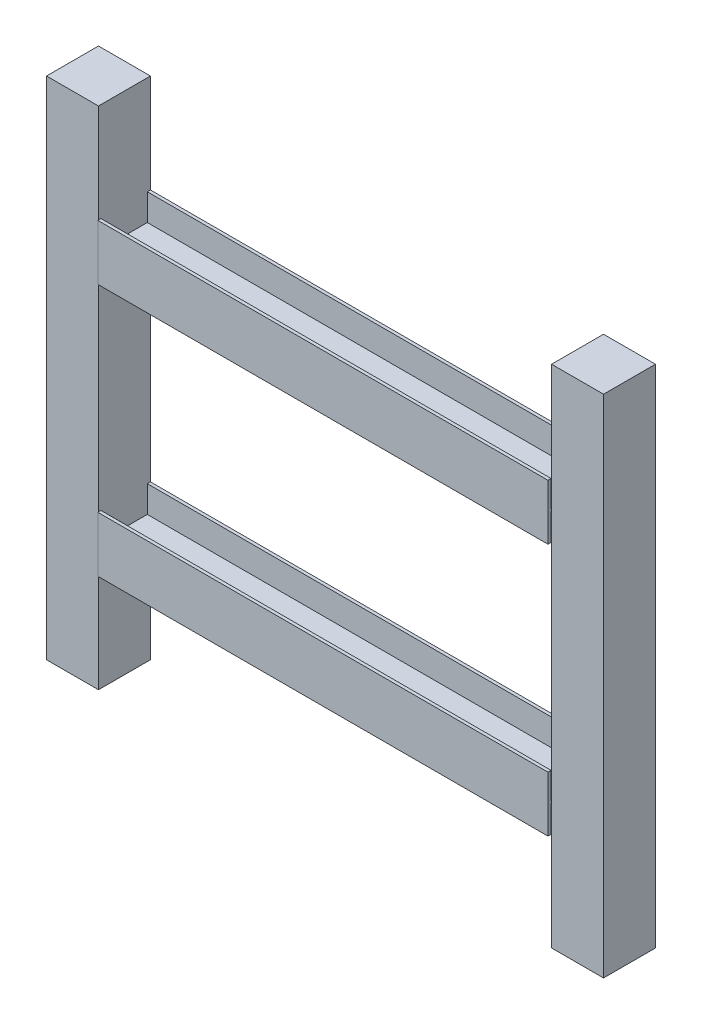
ISO-10303-21;
HEADER;
FILE_DESCRIPTION(('STEP AP214'),'2;1');
FILE_NAME('part.step','',(''),(''),'','','');
FILE_SCHEMA(('AUTOMOTIVE_DESIGN { 1 0 10303 214 1 1 1 1 }'));
ENDSEC;
DATA;
#1=APPLICATION_CONTEXT('core data for automotive mechanical design processes');
#2=APPLICATION_PROTOCOL_DEFINITION('international standard','automotive_design',2000,#1);
#3=PRODUCT_CONTEXT('',#1,'mechanical');
#4=PRODUCT('Part','Part','',(#3));
#5=PRODUCT_RELATED_PRODUCT_CATEGORY('part','',(#4));
#6=PRODUCT_DEFINITION_FORMATION('','',#4);
#7=PRODUCT_DEFINITION_CONTEXT('part definition',#1,'design');
#8=PRODUCT_DEFINITION('design','',#6,#7);
#9=PRODUCT_DEFINITION_SHAPE('','',#8);
#10=(LENGTH_UNIT() NAMED_UNIT(*) SI_UNIT(.MILLI.,.METRE.));
#11=(NAMED_UNIT(*) PLANE_ANGLE_UNIT() SI_UNIT($,.RADIAN.));
#12=(NAMED_UNIT(*) SI_UNIT($,.STERADIAN.) SOLID_ANGLE_UNIT());
#13=UNCERTAINTY_MEASURE_WITH_UNIT(LENGTH_MEASURE(1.E-05),#10,'distance_accuracy_value','');
#14=(GEOMETRIC_REPRESENTATION_CONTEXT(3) GLOBAL_UNCERTAINTY_ASSIGNED_CONTEXT((#13)) GLOBAL_UNIT_ASSIGNED_CONTEXT((#10,
#11,#12)) REPRESENTATION_CONTEXT('',''));
#15=CARTESIAN_POINT('',(0.,0.,0.));
#16=DIRECTION('',(0.,0.,1.));
#17=DIRECTION('',(1.,0.,0.));
#18=AXIS2_PLACEMENT_3D('',#15,#16,#17);
#19=CARTESIAN_POINT('',(1409.46226886423,1175.000000025,-104.565781535211));
#20=DIRECTION('',(0.,0.,-1.));
#21=DIRECTION('',(-1.,0.,0.));
#22=AXIS2_PLACEMENT_3D('',#19,#20,#21);
#23=PLANE('',#22);
#24=DIRECTION('',(0.,-1.,0.));
#25=VECTOR('',#24,1.);
#26=CARTESIAN_POINT('',(109.462268864228,1175.000000025,-104.565781535211));
#27=LINE('',#26,#25);
#28=CARTESIAN_POINT('',(109.462268864228,1175.000000025,-104.565781535211));
#29=VERTEX_POINT('',#28);
#30=CARTESIAN_POINT('',(109.462268864228,1097.99999993,-104.565781535211));
#31=VERTEX_POINT('',#30);
#32=EDGE_CURVE('E164',#29,#31,#27,.T.);
#33=ORIENTED_EDGE('',*,*,#32,.T.);
#34=DIRECTION('',(-1.,0.,0.));
#35=VECTOR('',#34,1.);
#36=CARTESIAN_POINT('',(1409.46226886423,1097.99999993,-104.565781535211));
#37=LINE('',#36,#35);
#38=CARTESIAN_POINT('',(1409.46226886423,1097.99999993,-104.565781535211));
#39=VERTEX_POINT('',#38);
#40=EDGE_CURVE('E12',#39,#31,#37,.T.);
#41=ORIENTED_EDGE('',*,*,#40,.F.);
#42=DIRECTION('',(0.,-1.,0.));
#43=VECTOR('',#42,1.);
#44=CARTESIAN_POINT('',(1409.46226886423,1175.000000025,-104.565781535211));
#45=LINE('',#44,#43);
#46=CARTESIAN_POINT('',(1409.46226886423,1175.000000025,-104.565781535211));
#47=VERTEX_POINT('',#46);
#48=EDGE_CURVE('E186',#47,#39,#45,.T.);
#49=ORIENTED_EDGE('',*,*,#48,.F.);
#50=DIRECTION('',(-1.,0.,0.));
#51=VECTOR('',#50,1.);
#52=CARTESIAN_POINT('',(1409.46226886423,1175.000000025,-104.565781535211));
#53=LINE('',#52,#51);
#54=EDGE_CURVE('E160',#47,#29,#53,.T.);
#55=ORIENTED_EDGE('',*,*,#54,.T.);
#56=EDGE_LOOP('',(#33,#41,#49,#55));
#57=FACE_BOUND('',#56,.T.);
#58=ADVANCED_FACE('F44',(#57),#23,.F.);
#59=CARTESIAN_POINT('',(1409.46226886423,1097.99999993,29.4342184697886));
#60=DIRECTION('',(0.,-1.,0.));
#61=DIRECTION('',(0.,0.,-1.));
#62=AXIS2_PLACEMENT_3D('',#59,#60,#61);
#63=PLANE('',#62);
#64=DIRECTION('',(0.,0.,1.));
#65=VECTOR('',#64,1.);
#66=CARTESIAN_POINT('',(109.462268864228,1097.99999993,29.4342184697886));
#67=LINE('',#66,#65);
#68=CARTESIAN_POINT('',(109.462268864228,1097.99999993,29.4342184697886));
#69=VERTEX_POINT('',#68);
#70=EDGE_CURVE('E167',#31,#69,#67,.T.);
#71=ORIENTED_EDGE('',*,*,#70,.T.);
#72=DIRECTION('',(-1.,0.,0.));
#73=VECTOR('',#72,1.);
#74=CARTESIAN_POINT('',(1409.46226886423,1097.99999993,29.4342184697886));
#75=LINE('',#74,#73);
#76=CARTESIAN_POINT('',(1409.46226886423,1097.99999993,29.4342184697886));
#77=VERTEX_POINT('',#76);
#78=EDGE_CURVE('E52',#77,#69,#75,.T.);
#79=ORIENTED_EDGE('',*,*,#78,.F.);
#80=DIRECTION('',(0.,0.,1.));
#81=VECTOR('',#80,1.);
#82=CARTESIAN_POINT('',(1409.46226886423,1097.99999993,29.4342184697886));
#83=LINE('',#82,#81);
#84=EDGE_CURVE('E115',#39,#77,#83,.T.);
#85=ORIENTED_EDGE('',*,*,#84,.F.);
#86=ORIENTED_EDGE('',*,*,#40,.T.);
#87=EDGE_LOOP('',(#71,#79,#85,#86));
#88=FACE_BOUND('',#87,.T.);
#89=ADVANCED_FACE('F264',(#88),#63,.F.);
#90=CARTESIAN_POINT('',(1409.46226886423,1097.99999993,29.4342184697886));
#91=DIRECTION('',(0.,0.,1.));
#92=DIRECTION('',(0.,-1.,0.));
#93=AXIS2_PLACEMENT_3D('',#90,#91,#92);
#94=PLANE('',#93);
#95=DIRECTION('',(0.,1.,0.));
#96=VECTOR('',#95,1.);
#97=CARTESIAN_POINT('',(109.462268864228,1097.99999993,29.4342184697886));
#98=LINE('',#97,#96);
#99=CARTESIAN_POINT('',(109.462268864228,1174.99999993,29.4342184697886));
#100=VERTEX_POINT('',#99);
#101=EDGE_CURVE('E169',#69,#100,#98,.T.);
#102=ORIENTED_EDGE('',*,*,#101,.T.);
#103=DIRECTION('',(-1.,0.,0.));
#104=VECTOR('',#103,1.);
#105=CARTESIAN_POINT('',(1409.46226886423,1174.99999993,29.4342184697886));
#106=LINE('',#105,#104);
#107=CARTESIAN_POINT('',(1409.46226886423,1174.99999993,29.4342184697886));
#108=VERTEX_POINT('',#107);
#109=EDGE_CURVE('E205',#108,#100,#106,.T.);
#110=ORIENTED_EDGE('',*,*,#109,.F.);
#111=DIRECTION('',(0.,1.,0.));
#112=VECTOR('',#111,1.);
#113=CARTESIAN_POINT('',(1409.46226886423,1097.99999993,29.4342184697886));
#114=LINE('',#113,#112);
#115=EDGE_CURVE('E213',#77,#108,#114,.T.);
#116=ORIENTED_EDGE('',*,*,#115,.F.);
#117=ORIENTED_EDGE('',*,*,#78,.T.);
#118=EDGE_LOOP('',(#102,#110,#116,#117));
#119=FACE_BOUND('',#118,.T.);
#120=ADVANCED_FACE('F211',(#119),#94,.F.);
#121=CARTESIAN_POINT('',(1409.46226886423,1174.99999993,38.4342184697883));
#122=DIRECTION('',(0.,-1.,0.));
#123=DIRECTION('',(0.,0.,-1.));
#124=AXIS2_PLACEMENT_3D('',#121,#122,#123);
#125=PLANE('',#124);
#126=DIRECTION('',(0.,0.,1.));
#127=VECTOR('',#126,1.);
#128=CARTESIAN_POINT('',(109.462268864228,1174.99999993,38.4342184697883));
#129=LINE('',#128,#127);
#130=CARTESIAN_POINT('',(109.462268864228,1174.99999993,38.4342184697883));
#131=VERTEX_POINT('',#130);
#132=EDGE_CURVE('E171',#100,#131,#129,.T.);
#133=ORIENTED_EDGE('',*,*,#132,.T.);
#134=DIRECTION('',(-1.,0.,0.));
#135=VECTOR('',#134,1.);
#136=CARTESIAN_POINT('',(1409.46226886423,1174.99999993,38.4342184697883));
#137=LINE('',#136,#135);
#138=CARTESIAN_POINT('',(1409.46226886423,1174.99999993,38.4342184697883));
#139=VERTEX_POINT('',#138);
#140=EDGE_CURVE('E202',#139,#131,#137,.T.);
#141=ORIENTED_EDGE('',*,*,#140,.F.);
#142=DIRECTION('',(0.,0.,1.));
#143=VECTOR('',#142,1.);
#144=CARTESIAN_POINT('',(1409.46226886423,1174.99999993,38.4342184697883));
#145=LINE('',#144,#143);
#146=EDGE_CURVE('E231',#108,#139,#145,.T.);
#147=ORIENTED_EDGE('',*,*,#146,.F.);
#148=ORIENTED_EDGE('',*,*,#109,.T.);
#149=EDGE_LOOP('',(#133,#141,#147,#148));
#150=FACE_BOUND('',#149,.T.);
#151=ADVANCED_FACE('F222',(#150),#125,.F.);
#152=CARTESIAN_POINT('',(1409.46226886423,1014.99999996,38.4342184697883));
#153=DIRECTION('',(0.,0.,-1.));
#154=DIRECTION('',(-1.,0.,0.));
#155=AXIS2_PLACEMENT_3D('',#152,#153,#154);
#156=PLANE('',#155);
#157=DIRECTION('',(0.,-1.,0.));
#158=VECTOR('',#157,1.);
#159=CARTESIAN_POINT('',(109.462268864228,1014.99999996,38.4342184697883));
#160=LINE('',#159,#158);
#161=CARTESIAN_POINT('',(109.462268864228,1014.99999996,38.4342184697883));
#162=VERTEX_POINT('',#161);
#163=EDGE_CURVE('E173',#131,#162,#160,.T.);
#164=ORIENTED_EDGE('',*,*,#163,.T.);
#165=DIRECTION('',(-1.,0.,0.));
#166=VECTOR('',#165,1.);
#167=CARTESIAN_POINT('',(1409.46226886423,1014.99999996,38.4342184697883));
#168=LINE('',#167,#166);
#169=CARTESIAN_POINT('',(1409.46226886423,1014.99999996,38.4342184697883));
#170=VERTEX_POINT('',#169);
#171=EDGE_CURVE('E199',#170,#162,#168,.T.);
#172=ORIENTED_EDGE('',*,*,#171,.F.);
#173=DIRECTION('',(0.,-1.,0.));
#174=VECTOR('',#173,1.);
#175=CARTESIAN_POINT('',(1409.46226886423,1014.99999996,38.4342184697883));
#176=LINE('',#175,#174);
#177=EDGE_CURVE('E228',#139,#170,#176,.T.);
#178=ORIENTED_EDGE('',*,*,#177,.F.);
#179=ORIENTED_EDGE('',*,*,#140,.T.);
#180=EDGE_LOOP('',(#164,#172,#178,#179));
#181=FACE_BOUND('',#180,.T.);
#182=ADVANCED_FACE('F226',(#181),#156,.F.);
#183=CARTESIAN_POINT('',(1409.46226886423,1014.99999996,38.4342184697883));
#184=DIRECTION('',(0.,1.,0.));
#185=DIRECTION('',(0.,0.,1.));
#186=AXIS2_PLACEMENT_3D('',#183,#184,#185);
#187=PLANE('',#186);
#188=DIRECTION('',(0.,0.,-1.));
#189=VECTOR('',#188,1.);
#190=CARTESIAN_POINT('',(109.462268864228,1014.99999996,38.4342184697883));
#191=LINE('',#190,#189);
#192=CARTESIAN_POINT('',(109.462268864228,1014.99999996,29.4342184697885));
#193=VERTEX_POINT('',#192);
#194=EDGE_CURVE('E175',#162,#193,#191,.T.);
#195=ORIENTED_EDGE('',*,*,#194,.T.);
#196=DIRECTION('',(-1.,0.,0.));
#197=VECTOR('',#196,1.);
#198=CARTESIAN_POINT('',(1409.46226886423,1014.99999996,29.4342184697885));
#199=LINE('',#198,#197);
#200=CARTESIAN_POINT('',(1409.46226886423,1014.99999996,29.4342184697885));
#201=VERTEX_POINT('',#200);
#202=EDGE_CURVE('E196',#201,#193,#199,.T.);
#203=ORIENTED_EDGE('',*,*,#202,.F.);
#204=DIRECTION('',(0.,0.,-1.));
#205=VECTOR('',#204,1.);
#206=CARTESIAN_POINT('',(1409.46226886423,1014.99999996,38.4342184697883));
#207=LINE('',#206,#205);
#208=EDGE_CURVE('E230',#170,#201,#207,.T.);
#209=ORIENTED_EDGE('',*,*,#208,.F.);
#210=ORIENTED_EDGE('',*,*,#171,.T.);
#211=EDGE_LOOP('',(#195,#203,#209,#210));
#212=FACE_BOUND('',#211,.T.);
#213=ADVANCED_FACE('F277',(#212),#187,.F.);
#214=CARTESIAN_POINT('',(1409.46226886423,1014.99999996,29.4342184697885));
#215=DIRECTION('',(0.,0.,1.));
#216=DIRECTION('',(0.,-1.,0.));
#217=AXIS2_PLACEMENT_3D('',#214,#215,#216);
#218=PLANE('',#217);
#219=DIRECTION('',(0.,1.,0.));
#220=VECTOR('',#219,1.);
#221=CARTESIAN_POINT('',(109.462268864228,1014.99999996,29.4342184697885));
#222=LINE('',#221,#220);
#223=CARTESIAN_POINT('',(109.462268864228,1091.99999996,29.4342184697886));
#224=VERTEX_POINT('',#223);
#225=EDGE_CURVE('E177',#193,#224,#222,.T.);
#226=ORIENTED_EDGE('',*,*,#225,.T.);
#227=DIRECTION('',(-1.,0.,0.));
#228=VECTOR('',#227,1.);
#229=CARTESIAN_POINT('',(1409.46226886423,1091.99999996,29.4342184697886));
#230=LINE('',#229,#228);
#231=CARTESIAN_POINT('',(1409.46226886423,1091.99999996,29.4342184697886));
#232=VERTEX_POINT('',#231);
#233=EDGE_CURVE('E193',#232,#224,#230,.T.);
#234=ORIENTED_EDGE('',*,*,#233,.F.);
#235=DIRECTION('',(0.,1.,0.));
#236=VECTOR('',#235,1.);
#237=CARTESIAN_POINT('',(1409.46226886423,1014.99999996,29.4342184697885));
#238=LINE('',#237,#236);
#239=EDGE_CURVE('E233',#201,#232,#238,.T.);
#240=ORIENTED_EDGE('',*,*,#239,.F.);
#241=ORIENTED_EDGE('',*,*,#202,.T.);
#242=EDGE_LOOP('',(#226,#234,#240,#241));
#243=FACE_BOUND('',#242,.T.);
#244=ADVANCED_FACE('F280',(#243),#218,.F.);
#245=CARTESIAN_POINT('',(1409.46226886423,1091.99999996,29.4342184697886));
#246=DIRECTION('',(0.,1.,0.));
#247=DIRECTION('',(0.,0.,1.));
#248=AXIS2_PLACEMENT_3D('',#245,#246,#247);
#249=PLANE('',#248);
#250=DIRECTION('',(0.,0.,-1.));
#251=VECTOR('',#250,1.);
#252=CARTESIAN_POINT('',(109.462268864228,1091.99999996,29.4342184697886));
#253=LINE('',#252,#251);
#254=CARTESIAN_POINT('',(109.462268864228,1091.99999996,-104.565781535211));
#255=VERTEX_POINT('',#254);
#256=EDGE_CURVE('E179',#224,#255,#253,.T.);
#257=ORIENTED_EDGE('',*,*,#256,.T.);
#258=DIRECTION('',(-1.,0.,0.));
#259=VECTOR('',#258,1.);
#260=CARTESIAN_POINT('',(1409.46226886423,1091.99999996,-104.565781535211));
#261=LINE('',#260,#259);
#262=CARTESIAN_POINT('',(1409.46226886423,1091.99999996,-104.565781535211));
#263=VERTEX_POINT('',#262);
#264=EDGE_CURVE('E190',#263,#255,#261,.T.);
#265=ORIENTED_EDGE('',*,*,#264,.F.);
#266=DIRECTION('',(0.,0.,-1.));
#267=VECTOR('',#266,1.);
#268=CARTESIAN_POINT('',(1409.46226886423,1091.99999996,29.4342184697886));
#269=LINE('',#268,#267);
#270=EDGE_CURVE('E239',#232,#263,#269,.T.);
#271=ORIENTED_EDGE('',*,*,#270,.F.);
#272=ORIENTED_EDGE('',*,*,#233,.T.);
#273=EDGE_LOOP('',(#257,#265,#271,#272));
#274=FACE_BOUND('',#273,.T.);
#275=ADVANCED_FACE('F245',(#274),#249,.F.);
#276=CARTESIAN_POINT('',(1409.46226886423,1091.99999996,-104.565781535211));
#277=DIRECTION('',(0.,0.,-1.));
#278=DIRECTION('',(-1.,0.,0.));
#279=AXIS2_PLACEMENT_3D('',#276,#277,#278);
#280=PLANE('',#279);
#281=DIRECTION('',(0.,-1.,0.));
#282=VECTOR('',#281,1.);
#283=CARTESIAN_POINT('',(109.462268864228,1091.99999996,-104.565781535211));
#284=LINE('',#283,#282);
#285=CARTESIAN_POINT('',(109.462268864228,1014.999999975,-104.565781535211));
#286=VERTEX_POINT('',#285);
#287=EDGE_CURVE('E181',#255,#286,#284,.T.);
#288=ORIENTED_EDGE('',*,*,#287,.T.);
#289=DIRECTION('',(-1.,0.,0.));
#290=VECTOR('',#289,1.);
#291=CARTESIAN_POINT('',(1409.46226886423,1014.999999975,-104.565781535211));
#292=LINE('',#291,#290);
#293=CARTESIAN_POINT('',(1409.46226886423,1014.999999975,-104.565781535211));
#294=VERTEX_POINT('',#293);
#295=EDGE_CURVE('E155',#294,#286,#292,.T.);
#296=ORIENTED_EDGE('',*,*,#295,.F.);
#297=DIRECTION('',(0.,-1.,0.));
#298=VECTOR('',#297,1.);
#299=CARTESIAN_POINT('',(1409.46226886423,1091.99999996,-104.565781535211));
#300=LINE('',#299,#298);
#301=EDGE_CURVE('E146',#263,#294,#300,.T.);
#302=ORIENTED_EDGE('',*,*,#301,.F.);
#303=ORIENTED_EDGE('',*,*,#264,.T.);
#304=EDGE_LOOP('',(#288,#296,#302,#303));
#305=FACE_BOUND('',#304,.T.);
#306=ADVANCED_FACE('F249',(#305),#280,.F.);
#307=CARTESIAN_POINT('',(1409.46226886423,1014.999999975,-113.565781515211));
#308=DIRECTION('',(0.,1.,0.));
#309=DIRECTION('',(0.,0.,1.));
#310=AXIS2_PLACEMENT_3D('',#307,#308,#309);
#311=PLANE('',#310);
#312=DIRECTION('',(0.,0.,-1.));
#313=VECTOR('',#312,1.);
#314=CARTESIAN_POINT('',(109.462268864228,1014.999999975,-113.565781515211));
#315=LINE('',#314,#313);
#316=CARTESIAN_POINT('',(109.462268864228,1014.999999975,-113.565781515211));
#317=VERTEX_POINT('',#316);
#318=EDGE_CURVE('E154',#286,#317,#315,.T.);
#319=ORIENTED_EDGE('',*,*,#318,.T.);
#320=DIRECTION('',(-1.,0.,0.));
#321=VECTOR('',#320,1.);
#322=CARTESIAN_POINT('',(1409.46226886423,1014.999999975,-113.565781515211));
#323=LINE('',#322,#321);
#324=CARTESIAN_POINT('',(1409.46226886423,1014.999999975,-113.565781515211));
#325=VERTEX_POINT('',#324);
#326=EDGE_CURVE('E151',#325,#317,#323,.T.);
#327=ORIENTED_EDGE('',*,*,#326,.F.);
#328=DIRECTION('',(0.,0.,-1.));
#329=VECTOR('',#328,1.);
#330=CARTESIAN_POINT('',(1409.46226886423,1014.999999975,-113.565781515211));
#331=LINE('',#330,#329);
#332=EDGE_CURVE('E140',#294,#325,#331,.T.);
#333=ORIENTED_EDGE('',*,*,#332,.F.);
#334=ORIENTED_EDGE('',*,*,#295,.T.);
#335=EDGE_LOOP('',(#319,#327,#333,#334));
#336=FACE_BOUND('',#335,.T.);
#337=ADVANCED_FACE('F152',(#336),#311,.F.);
#338=CARTESIAN_POINT('',(1409.46226886423,1175.000000025,-113.565781515211));
#339=DIRECTION('',(0.,0.,1.));
#340=DIRECTION('',(1.,0.,0.));
#341=AXIS2_PLACEMENT_3D('',#338,#339,#340);
#342=PLANE('',#341);
#343=DIRECTION('',(0.,1.,0.));
#344=VECTOR('',#343,1.);
#345=CARTESIAN_POINT('',(109.462268864228,1175.000000025,-113.565781515211));
#346=LINE('',#345,#344);
#347=CARTESIAN_POINT('',(109.462268864228,1175.000000025,-113.565781515211));
#348=VERTEX_POINT('',#347);
#349=EDGE_CURVE('E101',#317,#348,#346,.T.);
#350=ORIENTED_EDGE('',*,*,#349,.T.);
#351=DIRECTION('',(-1.,0.,0.));
#352=VECTOR('',#351,1.);
#353=CARTESIAN_POINT('',(1409.46226886423,1175.000000025,-113.565781515211));
#354=LINE('',#353,#352);
#355=CARTESIAN_POINT('',(1409.46226886423,1175.000000025,-113.565781515211));
#356=VERTEX_POINT('',#355);
#357=EDGE_CURVE('E156',#356,#348,#354,.T.);
#358=ORIENTED_EDGE('',*,*,#357,.F.);
#359=DIRECTION('',(0.,1.,0.));
#360=VECTOR('',#359,1.);
#361=CARTESIAN_POINT('',(1409.46226886423,1175.000000025,-113.565781515211));
#362=LINE('',#361,#360);
#363=EDGE_CURVE('E144',#325,#356,#362,.T.);
#364=ORIENTED_EDGE('',*,*,#363,.F.);
#365=ORIENTED_EDGE('',*,*,#326,.T.);
#366=EDGE_LOOP('',(#350,#358,#364,#365));
#367=FACE_BOUND('',#366,.T.);
#368=ADVANCED_FACE('F158',(#367),#342,.F.);
#369=CARTESIAN_POINT('',(1409.46226886423,1175.000000025,-113.565781515211));
#370=DIRECTION('',(0.,-1.,0.));
#371=DIRECTION('',(0.,0.,-1.));
#372=AXIS2_PLACEMENT_3D('',#369,#370,#371);
#373=PLANE('',#372);
#374=DIRECTION('',(0.,0.,1.));
#375=VECTOR('',#374,1.);
#376=CARTESIAN_POINT('',(109.462268864228,1175.000000025,-113.565781515211));
#377=LINE('',#376,#375);
#378=EDGE_CURVE('E107',#348,#29,#377,.T.);
#379=ORIENTED_EDGE('',*,*,#378,.T.);
#380=ORIENTED_EDGE('',*,*,#54,.F.);
#381=DIRECTION('',(0.,0.,1.));
#382=VECTOR('',#381,1.);
#383=CARTESIAN_POINT('',(1409.46226886423,1175.000000025,-113.565781515211));
#384=LINE('',#383,#382);
#385=EDGE_CURVE('E60',#356,#47,#384,.T.);
#386=ORIENTED_EDGE('',*,*,#385,.F.);
#387=ORIENTED_EDGE('',*,*,#357,.T.);
#388=EDGE_LOOP('',(#379,#380,#386,#387));
#389=FACE_BOUND('',#388,.T.);
#390=ADVANCED_FACE('F253',(#389),#373,.F.);
#391=CARTESIAN_POINT('',(1409.46226886423,1097.99999993,-104.565781535211));
#392=DIRECTION('',(1.,0.,0.));
#393=DIRECTION('',(0.,0.,-1.));
#394=AXIS2_PLACEMENT_3D('',#391,#392,#393);
#395=PLANE('',#394);
#396=ORIENTED_EDGE('',*,*,#48,.T.);
#397=ORIENTED_EDGE('',*,*,#84,.T.);
#398=ORIENTED_EDGE('',*,*,#115,.T.);
#399=ORIENTED_EDGE('',*,*,#146,.T.);
#400=ORIENTED_EDGE('',*,*,#177,.T.);
#401=ORIENTED_EDGE('',*,*,#208,.T.);
#402=ORIENTED_EDGE('',*,*,#239,.T.);
#403=ORIENTED_EDGE('',*,*,#270,.T.);
#404=ORIENTED_EDGE('',*,*,#301,.T.);
#405=ORIENTED_EDGE('',*,*,#332,.T.);
#406=ORIENTED_EDGE('',*,*,#363,.T.);
#407=ORIENTED_EDGE('',*,*,#385,.T.);
#408=EDGE_LOOP('',(#396,#397,#398,#399,#400,#401,#402,#403,#404,#405,#406,#407));
#409=FACE_BOUND('',#408,.T.);
#410=ADVANCED_FACE('F142',(#409),#395,.T.);
#411=CARTESIAN_POINT('',(109.462268864228,1097.99999993,-104.565781535211));
#412=DIRECTION('',(1.,0.,0.));
#413=DIRECTION('',(0.,0.,-1.));
#414=AXIS2_PLACEMENT_3D('',#411,#412,#413);
#415=PLANE('',#414);
#416=ORIENTED_EDGE('',*,*,#32,.F.);
#417=ORIENTED_EDGE('',*,*,#378,.F.);
#418=ORIENTED_EDGE('',*,*,#349,.F.);
#419=ORIENTED_EDGE('',*,*,#318,.F.);
#420=ORIENTED_EDGE('',*,*,#287,.F.);
#421=ORIENTED_EDGE('',*,*,#256,.F.);
#422=ORIENTED_EDGE('',*,*,#225,.F.);
#423=ORIENTED_EDGE('',*,*,#194,.F.);
#424=ORIENTED_EDGE('',*,*,#163,.F.);
#425=ORIENTED_EDGE('',*,*,#132,.F.);
#426=ORIENTED_EDGE('',*,*,#101,.F.);
#427=ORIENTED_EDGE('',*,*,#70,.F.);
#428=EDGE_LOOP('',(#416,#417,#418,#419,#420,#421,#422,#423,#424,#425,#426,#427));
#429=FACE_BOUND('',#428,.T.);
#430=ADVANCED_FACE('F217',(#429),#415,.F.);
#431=CLOSED_SHELL('',(#58,#89,#120,#151,#182,#213,#244,#275,#306,#337,#368,#390,#410,#430));
#432=MANIFOLD_SOLID_BREP('B2',#431);
#433=CARTESIAN_POINT('',(1409.46226886423,284.99999996,38.4342184697882));
#434=DIRECTION('',(0.,1.,0.));
#435=DIRECTION('',(0.,0.,1.));
#436=AXIS2_PLACEMENT_3D('',#433,#434,#435);
#437=PLANE('',#436);
#438=DIRECTION('',(0.,0.,-1.));
#439=VECTOR('',#438,1.);
#440=CARTESIAN_POINT('',(109.462268864228,284.99999996,38.4342184697882));
#441=LINE('',#440,#439);
#442=CARTESIAN_POINT('',(109.462268864228,284.99999996,38.4342184697882));
#443=VERTEX_POINT('',#442);
#444=CARTESIAN_POINT('',(109.462268864228,284.99999996,29.4342184697885));
#445=VERTEX_POINT('',#444);
#446=EDGE_CURVE('E506',#443,#445,#441,.T.);
#447=ORIENTED_EDGE('',*,*,#446,.T.);
#448=DIRECTION('',(-1.,0.,0.));
#449=VECTOR('',#448,1.);
#450=CARTESIAN_POINT('',(1409.46226886423,284.99999996,29.4342184697885));
#451=LINE('',#450,#449);
#452=CARTESIAN_POINT('',(1409.46226886423,284.99999996,29.4342184697885));
#453=VERTEX_POINT('',#452);
#454=EDGE_CURVE('E42',#453,#445,#451,.T.);
#455=ORIENTED_EDGE('',*,*,#454,.F.);
#456=DIRECTION('',(0.,0.,-1.));
#457=VECTOR('',#456,1.);
#458=CARTESIAN_POINT('',(1409.46226886423,284.99999996,38.4342184697882));
#459=LINE('',#458,#457);
#460=CARTESIAN_POINT('',(1409.46226886423,284.99999996,38.4342184697882));
#461=VERTEX_POINT('',#460);
#462=EDGE_CURVE('E528',#461,#453,#459,.T.);
#463=ORIENTED_EDGE('',*,*,#462,.F.);
#464=DIRECTION('',(-1.,0.,0.));
#465=VECTOR('',#464,1.);
#466=CARTESIAN_POINT('',(1409.46226886423,284.99999996,38.4342184697882));
#467=LINE('',#466,#465);
#468=EDGE_CURVE('E502',#461,#443,#467,.T.);
#469=ORIENTED_EDGE('',*,*,#468,.T.);
#470=EDGE_LOOP('',(#447,#455,#463,#469));
#471=FACE_BOUND('',#470,.T.);
#472=ADVANCED_FACE('F386',(#471),#437,.F.);
#473=CARTESIAN_POINT('',(1409.46226886423,284.99999996,29.4342184697885));
#474=DIRECTION('',(0.,0.,1.));
#475=DIRECTION('',(0.,-1.,0.));
#476=AXIS2_PLACEMENT_3D('',#473,#474,#475);
#477=PLANE('',#476);
#478=DIRECTION('',(0.,1.,0.));
#479=VECTOR('',#478,1.);
#480=CARTESIAN_POINT('',(109.462268864228,284.99999996,29.4342184697885));
#481=LINE('',#480,#479);
#482=CARTESIAN_POINT('',(109.462268864228,361.99999996,29.4342184697886));
#483=VERTEX_POINT('',#482);
#484=EDGE_CURVE('E509',#445,#483,#481,.T.);
#485=ORIENTED_EDGE('',*,*,#484,.T.);
#486=DIRECTION('',(-1.,0.,0.));
#487=VECTOR('',#486,1.);
#488=CARTESIAN_POINT('',(1409.46226886423,361.99999996,29.4342184697886));
#489=LINE('',#488,#487);
#490=CARTESIAN_POINT('',(1409.46226886423,361.99999996,29.4342184697886));
#491=VERTEX_POINT('',#490);
#492=EDGE_CURVE('E394',#491,#483,#489,.T.);
#493=ORIENTED_EDGE('',*,*,#492,.F.);
#494=DIRECTION('',(0.,1.,0.));
#495=VECTOR('',#494,1.);
#496=CARTESIAN_POINT('',(1409.46226886423,284.99999996,29.4342184697885));
#497=LINE('',#496,#495);
#498=EDGE_CURVE('E457',#453,#491,#497,.T.);
#499=ORIENTED_EDGE('',*,*,#498,.F.);
#500=ORIENTED_EDGE('',*,*,#454,.T.);
#501=EDGE_LOOP('',(#485,#493,#499,#500));
#502=FACE_BOUND('',#501,.T.);
#503=ADVANCED_FACE('F606',(#502),#477,.F.);
#504=CARTESIAN_POINT('',(1409.46226886423,361.99999996,29.4342184697886));
#505=DIRECTION('',(0.,1.,0.));
#506=DIRECTION('',(0.,0.,1.));
#507=AXIS2_PLACEMENT_3D('',#504,#505,#506);
#508=PLANE('',#507);
#509=DIRECTION('',(0.,0.,-1.));
#510=VECTOR('',#509,1.);
#511=CARTESIAN_POINT('',(109.462268864228,361.99999996,29.4342184697886));
#512=LINE('',#511,#510);
#513=CARTESIAN_POINT('',(109.462268864228,361.99999996,-104.565781535211));
#514=VERTEX_POINT('',#513);
#515=EDGE_CURVE('E511',#483,#514,#512,.T.);
#516=ORIENTED_EDGE('',*,*,#515,.T.);
#517=DIRECTION('',(-1.,0.,0.));
#518=VECTOR('',#517,1.);
#519=CARTESIAN_POINT('',(1409.46226886423,361.99999996,-104.565781535211));
#520=LINE('',#519,#518);
#521=CARTESIAN_POINT('',(1409.46226886423,361.99999996,-104.565781535211));
#522=VERTEX_POINT('',#521);
#523=EDGE_CURVE('E547',#522,#514,#520,.T.);
#524=ORIENTED_EDGE('',*,*,#523,.F.);
#525=DIRECTION('',(0.,0.,-1.));
#526=VECTOR('',#525,1.);
#527=CARTESIAN_POINT('',(1409.46226886423,361.99999996,29.4342184697886));
#528=LINE('',#527,#526);
#529=EDGE_CURVE('E555',#491,#522,#528,.T.);
#530=ORIENTED_EDGE('',*,*,#529,.F.);
#531=ORIENTED_EDGE('',*,*,#492,.T.);
#532=EDGE_LOOP('',(#516,#524,#530,#531));
#533=FACE_BOUND('',#532,.T.);
#534=ADVANCED_FACE('F553',(#533),#508,.F.);
#535=CARTESIAN_POINT('',(1409.46226886423,361.99999996,-104.565781535211));
#536=DIRECTION('',(0.,0.,-1.));
#537=DIRECTION('',(-1.,0.,0.));
#538=AXIS2_PLACEMENT_3D('',#535,#536,#537);
#539=PLANE('',#538);
#540=DIRECTION('',(0.,-1.,0.));
#541=VECTOR('',#540,1.);
#542=CARTESIAN_POINT('',(109.462268864228,361.99999996,-104.565781535211));
#543=LINE('',#542,#541);
#544=CARTESIAN_POINT('',(109.462268864228,284.999999975,-104.565781535211));
#545=VERTEX_POINT('',#544);
#546=EDGE_CURVE('E513',#514,#545,#543,.T.);
#547=ORIENTED_EDGE('',*,*,#546,.T.);
#548=DIRECTION('',(-1.,0.,0.));
#549=VECTOR('',#548,1.);
#550=CARTESIAN_POINT('',(1409.46226886423,284.999999975,-104.565781535211));
#551=LINE('',#550,#549);
#552=CARTESIAN_POINT('',(1409.46226886423,284.999999975,-104.565781535211));
#553=VERTEX_POINT('',#552);
#554=EDGE_CURVE('E544',#553,#545,#551,.T.);
#555=ORIENTED_EDGE('',*,*,#554,.F.);
#556=DIRECTION('',(0.,-1.,0.));
#557=VECTOR('',#556,1.);
#558=CARTESIAN_POINT('',(1409.46226886423,361.99999996,-104.565781535211));
#559=LINE('',#558,#557);
#560=EDGE_CURVE('E573',#522,#553,#559,.T.);
#561=ORIENTED_EDGE('',*,*,#560,.F.);
#562=ORIENTED_EDGE('',*,*,#523,.T.);
#563=EDGE_LOOP('',(#547,#555,#561,#562));
#564=FACE_BOUND('',#563,.T.);
#565=ADVANCED_FACE('F564',(#564),#539,.F.);
#566=CARTESIAN_POINT('',(1409.46226886423,284.999999975,-113.565781515211));
#567=DIRECTION('',(0.,1.,0.));
#568=DIRECTION('',(0.,0.,1.));
#569=AXIS2_PLACEMENT_3D('',#566,#567,#568);
#570=PLANE('',#569);
#571=DIRECTION('',(0.,0.,-1.));
#572=VECTOR('',#571,1.);
#573=CARTESIAN_POINT('',(109.462268864228,284.999999975,-113.565781515211));
#574=LINE('',#573,#572);
#575=CARTESIAN_POINT('',(109.462268864228,284.999999975,-113.565781515211));
#576=VERTEX_POINT('',#575);
#577=EDGE_CURVE('E515',#545,#576,#574,.T.);
#578=ORIENTED_EDGE('',*,*,#577,.T.);
#579=DIRECTION('',(-1.,0.,0.));
#580=VECTOR('',#579,1.);
#581=CARTESIAN_POINT('',(1409.46226886423,284.999999975,-113.565781515211));
#582=LINE('',#581,#580);
#583=CARTESIAN_POINT('',(1409.46226886423,284.999999975,-113.565781515211));
#584=VERTEX_POINT('',#583);
#585=EDGE_CURVE('E541',#584,#576,#582,.T.);
#586=ORIENTED_EDGE('',*,*,#585,.F.);
#587=DIRECTION('',(0.,0.,-1.));
#588=VECTOR('',#587,1.);
#589=CARTESIAN_POINT('',(1409.46226886423,284.999999975,-113.565781515211));
#590=LINE('',#589,#588);
#591=EDGE_CURVE('E570',#553,#584,#590,.T.);
#592=ORIENTED_EDGE('',*,*,#591,.F.);
#593=ORIENTED_EDGE('',*,*,#554,.T.);
#594=EDGE_LOOP('',(#578,#586,#592,#593));
#595=FACE_BOUND('',#594,.T.);
#596=ADVANCED_FACE('F568',(#595),#570,.F.);
#597=CARTESIAN_POINT('',(1409.46226886423,445.000000025,-113.565781515211));
#598=DIRECTION('',(0.,0.,1.));
#599=DIRECTION('',(1.,0.,0.));
#600=AXIS2_PLACEMENT_3D('',#597,#598,#599);
#601=PLANE('',#600);
#602=DIRECTION('',(0.,1.,0.));
#603=VECTOR('',#602,1.);
#604=CARTESIAN_POINT('',(109.462268864228,445.000000025,-113.565781515211));
#605=LINE('',#604,#603);
#606=CARTESIAN_POINT('',(109.462268864228,445.000000025,-113.565781515211));
#607=VERTEX_POINT('',#606);
#608=EDGE_CURVE('E517',#576,#607,#605,.T.);
#609=ORIENTED_EDGE('',*,*,#608,.T.);
#610=DIRECTION('',(-1.,0.,0.));
#611=VECTOR('',#610,1.);
#612=CARTESIAN_POINT('',(1409.46226886423,445.000000025,-113.565781515211));
#613=LINE('',#612,#611);
#614=CARTESIAN_POINT('',(1409.46226886423,445.000000025,-113.565781515211));
#615=VERTEX_POINT('',#614);
#616=EDGE_CURVE('E538',#615,#607,#613,.T.);
#617=ORIENTED_EDGE('',*,*,#616,.F.);
#618=DIRECTION('',(0.,1.,0.));
#619=VECTOR('',#618,1.);
#620=CARTESIAN_POINT('',(1409.46226886423,445.000000025,-113.565781515211));
#621=LINE('',#620,#619);
#622=EDGE_CURVE('E572',#584,#615,#621,.T.);
#623=ORIENTED_EDGE('',*,*,#622,.F.);
#624=ORIENTED_EDGE('',*,*,#585,.T.);
#625=EDGE_LOOP('',(#609,#617,#623,#624));
#626=FACE_BOUND('',#625,.T.);
#627=ADVANCED_FACE('F619',(#626),#601,.F.);
#628=CARTESIAN_POINT('',(1409.46226886423,445.000000025,-113.565781515211));
#629=DIRECTION('',(0.,-1.,0.));
#630=DIRECTION('',(0.,0.,-1.));
#631=AXIS2_PLACEMENT_3D('',#628,#629,#630);
#632=PLANE('',#631);
#633=DIRECTION('',(0.,0.,1.));
#634=VECTOR('',#633,1.);
#635=CARTESIAN_POINT('',(109.462268864228,445.000000025,-113.565781515211));
#636=LINE('',#635,#634);
#637=CARTESIAN_POINT('',(109.462268864228,445.000000025,-104.565781535211));
#638=VERTEX_POINT('',#637);
#639=EDGE_CURVE('E519',#607,#638,#636,.T.);
#640=ORIENTED_EDGE('',*,*,#639,.T.);
#641=DIRECTION('',(-1.,0.,0.));
#642=VECTOR('',#641,1.);
#643=CARTESIAN_POINT('',(1409.46226886423,445.000000025,-104.565781535211));
#644=LINE('',#643,#642);
#645=CARTESIAN_POINT('',(1409.46226886423,445.000000025,-104.565781535211));
#646=VERTEX_POINT('',#645);
#647=EDGE_CURVE('E535',#646,#638,#644,.T.);
#648=ORIENTED_EDGE('',*,*,#647,.F.);
#649=DIRECTION('',(0.,0.,1.));
#650=VECTOR('',#649,1.);
#651=CARTESIAN_POINT('',(1409.46226886423,445.000000025,-113.565781515211));
#652=LINE('',#651,#650);
#653=EDGE_CURVE('E575',#615,#646,#652,.T.);
#654=ORIENTED_EDGE('',*,*,#653,.F.);
#655=ORIENTED_EDGE('',*,*,#616,.T.);
#656=EDGE_LOOP('',(#640,#648,#654,#655));
#657=FACE_BOUND('',#656,.T.);
#658=ADVANCED_FACE('F622',(#657),#632,.F.);
#659=CARTESIAN_POINT('',(1409.46226886423,445.000000025,-104.565781535211));
#660=DIRECTION('',(0.,0.,-1.));
#661=DIRECTION('',(-1.,0.,0.));
#662=AXIS2_PLACEMENT_3D('',#659,#660,#661);
#663=PLANE('',#662);
#664=DIRECTION('',(0.,-1.,0.));
#665=VECTOR('',#664,1.);
#666=CARTESIAN_POINT('',(109.462268864228,445.000000025,-104.565781535211));
#667=LINE('',#666,#665);
#668=CARTESIAN_POINT('',(109.462268864228,367.99999993,-104.565781535211));
#669=VERTEX_POINT('',#668);
#670=EDGE_CURVE('E521',#638,#669,#667,.T.);
#671=ORIENTED_EDGE('',*,*,#670,.T.);
#672=DIRECTION('',(-1.,0.,0.));
#673=VECTOR('',#672,1.);
#674=CARTESIAN_POINT('',(1409.46226886423,367.99999993,-104.565781535211));
#675=LINE('',#674,#673);
#676=CARTESIAN_POINT('',(1409.46226886423,367.99999993,-104.565781535211));
#677=VERTEX_POINT('',#676);
#678=EDGE_CURVE('E532',#677,#669,#675,.T.);
#679=ORIENTED_EDGE('',*,*,#678,.F.);
#680=DIRECTION('',(0.,-1.,0.));
#681=VECTOR('',#680,1.);
#682=CARTESIAN_POINT('',(1409.46226886423,445.000000025,-104.565781535211));
#683=LINE('',#682,#681);
#684=EDGE_CURVE('E581',#646,#677,#683,.T.);
#685=ORIENTED_EDGE('',*,*,#684,.F.);
#686=ORIENTED_EDGE('',*,*,#647,.T.);
#687=EDGE_LOOP('',(#671,#679,#685,#686));
#688=FACE_BOUND('',#687,.T.);
#689=ADVANCED_FACE('F587',(#688),#663,.F.);
#690=CARTESIAN_POINT('',(1409.46226886423,367.99999993,29.4342184697886));
#691=DIRECTION('',(0.,-1.,0.));
#692=DIRECTION('',(0.,0.,-1.));
#693=AXIS2_PLACEMENT_3D('',#690,#691,#692);
#694=PLANE('',#693);
#695=DIRECTION('',(0.,0.,1.));
#696=VECTOR('',#695,1.);
#697=CARTESIAN_POINT('',(109.462268864228,367.99999993,29.4342184697886));
#698=LINE('',#697,#696);
#699=CARTESIAN_POINT('',(109.462268864228,367.99999993,29.4342184697886));
#700=VERTEX_POINT('',#699);
#701=EDGE_CURVE('E523',#669,#700,#698,.T.);
#702=ORIENTED_EDGE('',*,*,#701,.T.);
#703=DIRECTION('',(-1.,0.,0.));
#704=VECTOR('',#703,1.);
#705=CARTESIAN_POINT('',(1409.46226886423,367.99999993,29.4342184697886));
#706=LINE('',#705,#704);
#707=CARTESIAN_POINT('',(1409.46226886423,367.99999993,29.4342184697886));
#708=VERTEX_POINT('',#707);
#709=EDGE_CURVE('E497',#708,#700,#706,.T.);
#710=ORIENTED_EDGE('',*,*,#709,.F.);
#711=DIRECTION('',(0.,0.,1.));
#712=VECTOR('',#711,1.);
#713=CARTESIAN_POINT('',(1409.46226886423,367.99999993,29.4342184697886));
#714=LINE('',#713,#712);
#715=EDGE_CURVE('E488',#677,#708,#714,.T.);
#716=ORIENTED_EDGE('',*,*,#715,.F.);
#717=ORIENTED_EDGE('',*,*,#678,.T.);
#718=EDGE_LOOP('',(#702,#710,#716,#717));
#719=FACE_BOUND('',#718,.T.);
#720=ADVANCED_FACE('F591',(#719),#694,.F.);
#721=CARTESIAN_POINT('',(1409.46226886423,367.99999993,29.4342184697886));
#722=DIRECTION('',(0.,0.,1.));
#723=DIRECTION('',(0.,-1.,0.));
#724=AXIS2_PLACEMENT_3D('',#721,#722,#723);
#725=PLANE('',#724);
#726=DIRECTION('',(0.,1.,0.));
#727=VECTOR('',#726,1.);
#728=CARTESIAN_POINT('',(109.462268864228,367.99999993,29.4342184697886));
#729=LINE('',#728,#727);
#730=CARTESIAN_POINT('',(109.462268864228,444.99999993,29.4342184697886));
#731=VERTEX_POINT('',#730);
#732=EDGE_CURVE('E496',#700,#731,#729,.T.);
#733=ORIENTED_EDGE('',*,*,#732,.T.);
#734=DIRECTION('',(-1.,0.,0.));
#735=VECTOR('',#734,1.);
#736=CARTESIAN_POINT('',(1409.46226886423,444.99999993,29.4342184697886));
#737=LINE('',#736,#735);
#738=CARTESIAN_POINT('',(1409.46226886423,444.99999993,29.4342184697886));
#739=VERTEX_POINT('',#738);
#740=EDGE_CURVE('E493',#739,#731,#737,.T.);
#741=ORIENTED_EDGE('',*,*,#740,.F.);
#742=DIRECTION('',(0.,1.,0.));
#743=VECTOR('',#742,1.);
#744=CARTESIAN_POINT('',(1409.46226886423,367.99999993,29.4342184697886));
#745=LINE('',#744,#743);
#746=EDGE_CURVE('E482',#708,#739,#745,.T.);
#747=ORIENTED_EDGE('',*,*,#746,.F.);
#748=ORIENTED_EDGE('',*,*,#709,.T.);
#749=EDGE_LOOP('',(#733,#741,#747,#748));
#750=FACE_BOUND('',#749,.T.);
#751=ADVANCED_FACE('F494',(#750),#725,.F.);
#752=CARTESIAN_POINT('',(1409.46226886423,444.99999993,38.4342184697882));
#753=DIRECTION('',(0.,-1.,0.));
#754=DIRECTION('',(0.,0.,-1.));
#755=AXIS2_PLACEMENT_3D('',#752,#753,#754);
#756=PLANE('',#755);
#757=DIRECTION('',(0.,0.,1.));
#758=VECTOR('',#757,1.);
#759=CARTESIAN_POINT('',(109.462268864228,444.99999993,38.4342184697882));
#760=LINE('',#759,#758);
#761=CARTESIAN_POINT('',(109.462268864228,444.99999993,38.4342184697882));
#762=VERTEX_POINT('',#761);
#763=EDGE_CURVE('E443',#731,#762,#760,.T.);
#764=ORIENTED_EDGE('',*,*,#763,.T.);
#765=DIRECTION('',(-1.,0.,0.));
#766=VECTOR('',#765,1.);
#767=CARTESIAN_POINT('',(1409.46226886423,444.99999993,38.4342184697882));
#768=LINE('',#767,#766);
#769=CARTESIAN_POINT('',(1409.46226886423,444.99999993,38.4342184697882));
#770=VERTEX_POINT('',#769);
#771=EDGE_CURVE('E498',#770,#762,#768,.T.);
#772=ORIENTED_EDGE('',*,*,#771,.F.);
#773=DIRECTION('',(0.,0.,1.));
#774=VECTOR('',#773,1.);
#775=CARTESIAN_POINT('',(1409.46226886423,444.99999993,38.4342184697882));
#776=LINE('',#775,#774);
#777=EDGE_CURVE('E486',#739,#770,#776,.T.);
#778=ORIENTED_EDGE('',*,*,#777,.F.);
#779=ORIENTED_EDGE('',*,*,#740,.T.);
#780=EDGE_LOOP('',(#764,#772,#778,#779));
#781=FACE_BOUND('',#780,.T.);
#782=ADVANCED_FACE('F500',(#781),#756,.F.);
#783=CARTESIAN_POINT('',(1409.46226886423,284.99999996,38.4342184697882));
#784=DIRECTION('',(0.,0.,-1.));
#785=DIRECTION('',(-1.,0.,0.));
#786=AXIS2_PLACEMENT_3D('',#783,#784,#785);
#787=PLANE('',#786);
#788=DIRECTION('',(0.,-1.,0.));
#789=VECTOR('',#788,1.);
#790=CARTESIAN_POINT('',(109.462268864228,284.99999996,38.4342184697882));
#791=LINE('',#790,#789);
#792=EDGE_CURVE('E449',#762,#443,#791,.T.);
#793=ORIENTED_EDGE('',*,*,#792,.T.);
#794=ORIENTED_EDGE('',*,*,#468,.F.);
#795=DIRECTION('',(0.,-1.,0.));
#796=VECTOR('',#795,1.);
#797=CARTESIAN_POINT('',(1409.46226886423,284.99999996,38.4342184697882));
#798=LINE('',#797,#796);
#799=EDGE_CURVE('E402',#770,#461,#798,.T.);
#800=ORIENTED_EDGE('',*,*,#799,.F.);
#801=ORIENTED_EDGE('',*,*,#771,.T.);
#802=EDGE_LOOP('',(#793,#794,#800,#801));
#803=FACE_BOUND('',#802,.T.);
#804=ADVANCED_FACE('F595',(#803),#787,.F.);
#805=CARTESIAN_POINT('',(1409.46226886423,284.99999996,29.4342184697885));
#806=DIRECTION('',(1.,0.,0.));
#807=DIRECTION('',(0.,0.,-1.));
#808=AXIS2_PLACEMENT_3D('',#805,#806,#807);
#809=PLANE('',#808);
#810=ORIENTED_EDGE('',*,*,#462,.T.);
#811=ORIENTED_EDGE('',*,*,#498,.T.);
#812=ORIENTED_EDGE('',*,*,#529,.T.);
#813=ORIENTED_EDGE('',*,*,#560,.T.);
#814=ORIENTED_EDGE('',*,*,#591,.T.);
#815=ORIENTED_EDGE('',*,*,#622,.T.);
#816=ORIENTED_EDGE('',*,*,#653,.T.);
#817=ORIENTED_EDGE('',*,*,#684,.T.);
#818=ORIENTED_EDGE('',*,*,#715,.T.);
#819=ORIENTED_EDGE('',*,*,#746,.T.);
#820=ORIENTED_EDGE('',*,*,#777,.T.);
#821=ORIENTED_EDGE('',*,*,#799,.T.);
#822=EDGE_LOOP('',(#810,#811,#812,#813,#814,#815,#816,#817,#818,#819,#820,#821));
#823=FACE_BOUND('',#822,.T.);
#824=ADVANCED_FACE('F484',(#823),#809,.T.);
#825=CARTESIAN_POINT('',(109.462268864228,284.99999996,29.4342184697885));
#826=DIRECTION('',(1.,0.,0.));
#827=DIRECTION('',(0.,0.,-1.));
#828=AXIS2_PLACEMENT_3D('',#825,#826,#827);
#829=PLANE('',#828);
#830=ORIENTED_EDGE('',*,*,#446,.F.);
#831=ORIENTED_EDGE('',*,*,#792,.F.);
#832=ORIENTED_EDGE('',*,*,#763,.F.);
#833=ORIENTED_EDGE('',*,*,#732,.F.);
#834=ORIENTED_EDGE('',*,*,#701,.F.);
#835=ORIENTED_EDGE('',*,*,#670,.F.);
#836=ORIENTED_EDGE('',*,*,#639,.F.);
#837=ORIENTED_EDGE('',*,*,#608,.F.);
#838=ORIENTED_EDGE('',*,*,#577,.F.);
#839=ORIENTED_EDGE('',*,*,#546,.F.);
#840=ORIENTED_EDGE('',*,*,#515,.F.);
#841=ORIENTED_EDGE('',*,*,#484,.F.);
#842=EDGE_LOOP('',(#830,#831,#832,#833,#834,#835,#836,#837,#838,#839,#840,#841));
#843=FACE_BOUND('',#842,.T.);
#844=ADVANCED_FACE('F559',(#843),#829,.F.);
#845=CLOSED_SHELL('',(#472,#503,#534,#565,#596,#627,#658,#689,#720,#751,#782,#804,#824,#844));
#846=MANIFOLD_SOLID_BREP('B6',#845);
#847=CARTESIAN_POINT('',(1409.46226886423,1460.,27.9895394525767));
#848=DIRECTION('',(1.,0.,0.));
#849=DIRECTION('',(0.,0.,-1.));
#850=AXIS2_PLACEMENT_3D('',#847,#848,#849);
#851=PLANE('',#850);
#852=DIRECTION('',(0.,0.,1.));
#853=VECTOR('',#852,1.);
#854=CARTESIAN_POINT('',(1409.46226886423,0.,27.9895394525767));
#855=LINE('',#854,#853);
#856=CARTESIAN_POINT('',(1409.46226886423,0.,-122.010460547423));
#857=VERTEX_POINT('',#856);
#858=CARTESIAN_POINT('',(1409.46226886423,0.,27.9895394525767));
#859=VERTEX_POINT('',#858);
#860=EDGE_CURVE('E790',#857,#859,#855,.T.);
#861=ORIENTED_EDGE('',*,*,#860,.T.);
#862=DIRECTION('',(0.,-1.,0.));
#863=VECTOR('',#862,1.);
#864=CARTESIAN_POINT('',(1409.46226886423,1460.,27.9895394525767));
#865=LINE('',#864,#863);
#866=CARTESIAN_POINT('',(1409.46226886423,1460.,27.9895394525767));
#867=VERTEX_POINT('',#866);
#868=EDGE_CURVE('E384',#867,#859,#865,.T.);
#869=ORIENTED_EDGE('',*,*,#868,.F.);
#870=DIRECTION('',(0.,0.,1.));
#871=VECTOR('',#870,1.);
#872=CARTESIAN_POINT('',(1409.46226886423,1460.,27.9895394525767));
#873=LINE('',#872,#871);
#874=CARTESIAN_POINT('',(1409.46226886423,1460.,-122.010460547423));
#875=VERTEX_POINT('',#874);
#876=EDGE_CURVE('E778',#875,#867,#873,.T.);
#877=ORIENTED_EDGE('',*,*,#876,.F.);
#878=DIRECTION('',(0.,-1.,0.));
#879=VECTOR('',#878,1.);
#880=CARTESIAN_POINT('',(1409.46226886423,1460.,-122.010460547423));
#881=LINE('',#880,#879);
#882=EDGE_CURVE('E786',#875,#857,#881,.T.);
#883=ORIENTED_EDGE('',*,*,#882,.T.);
#884=EDGE_LOOP('',(#861,#869,#877,#883));
#885=FACE_BOUND('',#884,.T.);
#886=ADVANCED_FACE('F727',(#885),#851,.F.);
#887=CARTESIAN_POINT('',(1409.46226886423,1460.,27.9895394525767));
#888=DIRECTION('',(0.,0.,-1.));
#889=DIRECTION('',(-1.,0.,0.));
#890=AXIS2_PLACEMENT_3D('',#887,#888,#889);
#891=PLANE('',#890);
#892=DIRECTION('',(1.,0.,0.));
#893=VECTOR('',#892,1.);
#894=CARTESIAN_POINT('',(1409.46226886423,0.,27.9895394525767));
#895=LINE('',#894,#893);
#896=CARTESIAN_POINT('',(1559.46226886423,0.,27.9895394525767));
#897=VERTEX_POINT('',#896);
#898=EDGE_CURVE('E782',#859,#897,#895,.T.);
#899=ORIENTED_EDGE('',*,*,#898,.T.);
#900=DIRECTION('',(0.,-1.,0.));
#901=VECTOR('',#900,1.);
#902=CARTESIAN_POINT('',(1559.46226886423,1460.,27.9895394525767));
#903=LINE('',#902,#901);
#904=CARTESIAN_POINT('',(1559.46226886423,1460.,27.9895394525767));
#905=VERTEX_POINT('',#904);
#906=EDGE_CURVE('E735',#905,#897,#903,.T.);
#907=ORIENTED_EDGE('',*,*,#906,.F.);
#908=DIRECTION('',(1.,0.,0.));
#909=VECTOR('',#908,1.);
#910=CARTESIAN_POINT('',(1409.46226886423,1460.,27.9895394525767));
#911=LINE('',#910,#909);
#912=EDGE_CURVE('E773',#867,#905,#911,.T.);
#913=ORIENTED_EDGE('',*,*,#912,.F.);
#914=ORIENTED_EDGE('',*,*,#868,.T.);
#915=EDGE_LOOP('',(#899,#907,#913,#914));
#916=FACE_BOUND('',#915,.T.);
#917=ADVANCED_FACE('F781',(#916),#891,.F.);
#918=CARTESIAN_POINT('',(1559.46226886423,1460.,27.9895394525767));
#919=DIRECTION('',(-1.,0.,0.));
#920=DIRECTION('',(0.,0.,1.));
#921=AXIS2_PLACEMENT_3D('',#918,#919,#920);
#922=PLANE('',#921);
#923=DIRECTION('',(0.,0.,-1.));
#924=VECTOR('',#923,1.);
#925=CARTESIAN_POINT('',(1559.46226886423,0.,27.9895394525767));
#926=LINE('',#925,#924);
#927=CARTESIAN_POINT('',(1559.46226886423,0.,-122.010460547423));
#928=VERTEX_POINT('',#927);
#929=EDGE_CURVE('E760',#897,#928,#926,.T.);
#930=ORIENTED_EDGE('',*,*,#929,.T.);
#931=DIRECTION('',(0.,-1.,0.));
#932=VECTOR('',#931,1.);
#933=CARTESIAN_POINT('',(1559.46226886423,1460.,-122.010460547423));
#934=LINE('',#933,#932);
#935=CARTESIAN_POINT('',(1559.46226886423,1460.,-122.010460547423));
#936=VERTEX_POINT('',#935);
#937=EDGE_CURVE('E783',#936,#928,#934,.T.);
#938=ORIENTED_EDGE('',*,*,#937,.F.);
#939=DIRECTION('',(0.,0.,-1.));
#940=VECTOR('',#939,1.);
#941=CARTESIAN_POINT('',(1559.46226886423,1460.,27.9895394525767));
#942=LINE('',#941,#940);
#943=EDGE_CURVE('E776',#905,#936,#942,.T.);
#944=ORIENTED_EDGE('',*,*,#943,.F.);
#945=ORIENTED_EDGE('',*,*,#906,.T.);
#946=EDGE_LOOP('',(#930,#938,#944,#945));
#947=FACE_BOUND('',#946,.T.);
#948=ADVANCED_FACE('F784',(#947),#922,.F.);
#949=CARTESIAN_POINT('',(1409.46226886423,1460.,-122.010460547423));
#950=DIRECTION('',(0.,0.,1.));
#951=DIRECTION('',(1.,0.,0.));
#952=AXIS2_PLACEMENT_3D('',#949,#950,#951);
#953=PLANE('',#952);
#954=DIRECTION('',(-1.,0.,0.));
#955=VECTOR('',#954,1.);
#956=CARTESIAN_POINT('',(1409.46226886423,0.,-122.010460547423));
#957=LINE('',#956,#955);
#958=EDGE_CURVE('E766',#928,#857,#957,.T.);
#959=ORIENTED_EDGE('',*,*,#958,.T.);
#960=ORIENTED_EDGE('',*,*,#882,.F.);
#961=DIRECTION('',(-1.,0.,0.));
#962=VECTOR('',#961,1.);
#963=CARTESIAN_POINT('',(1409.46226886423,1460.,-122.010460547423));
#964=LINE('',#963,#962);
#965=EDGE_CURVE('E743',#936,#875,#964,.T.);
#966=ORIENTED_EDGE('',*,*,#965,.F.);
#967=ORIENTED_EDGE('',*,*,#937,.T.);
#968=EDGE_LOOP('',(#959,#960,#966,#967));
#969=FACE_BOUND('',#968,.T.);
#970=ADVANCED_FACE('F797',(#969),#953,.F.);
#971=CARTESIAN_POINT('',(1409.46226886423,1460.,-122.010460547423));
#972=DIRECTION('',(0.,-1.,0.));
#973=DIRECTION('',(0.,0.,-1.));
#974=AXIS2_PLACEMENT_3D('',#971,#972,#973);
#975=PLANE('',#974);
#976=ORIENTED_EDGE('',*,*,#876,.T.);
#977=ORIENTED_EDGE('',*,*,#912,.T.);
#978=ORIENTED_EDGE('',*,*,#943,.T.);
#979=ORIENTED_EDGE('',*,*,#965,.T.);
#980=EDGE_LOOP('',(#976,#977,#978,#979));
#981=FACE_BOUND('',#980,.T.);
#982=ADVANCED_FACE('F774',(#981),#975,.F.);
#983=CARTESIAN_POINT('',(1409.46226886423,0.,-122.010460547423));
#984=DIRECTION('',(0.,-1.,0.));
#985=DIRECTION('',(0.,0.,-1.));
#986=AXIS2_PLACEMENT_3D('',#983,#984,#985);
#987=PLANE('',#986);
#988=ORIENTED_EDGE('',*,*,#860,.F.);
#989=ORIENTED_EDGE('',*,*,#958,.F.);
#990=ORIENTED_EDGE('',*,*,#929,.F.);
#991=ORIENTED_EDGE('',*,*,#898,.F.);
#992=EDGE_LOOP('',(#988,#989,#990,#991));
#993=FACE_BOUND('',#992,.T.);
#994=ADVANCED_FACE('F800',(#993),#987,.T.);
#995=CLOSED_SHELL('',(#886,#917,#948,#970,#982,#994));
#996=MANIFOLD_SOLID_BREP('B36',#995);
#997=CARTESIAN_POINT('',(-40.5377311357715,1460.,36.4342184747885));
#998=DIRECTION('',(1.,0.,0.));
#999=DIRECTION('',(0.,0.,-1.));
#1000=AXIS2_PLACEMENT_3D('',#997,#998,#999);
#1001=PLANE('',#1000);
#1002=DIRECTION('',(0.,0.,1.));
#1003=VECTOR('',#1002,1.);
#1004=CARTESIAN_POINT('',(-40.5377311357715,0.,36.4342184747885));
#1005=LINE('',#1004,#1003);
#1006=CARTESIAN_POINT('',(-40.5377311357715,0.,-113.565781525211));
#1007=VERTEX_POINT('',#1006);
#1008=CARTESIAN_POINT('',(-40.5377311357715,0.,36.4342184747885));
#1009=VERTEX_POINT('',#1008);
#1010=EDGE_CURVE('E914',#1007,#1009,#1005,.T.);
#1011=ORIENTED_EDGE('',*,*,#1010,.T.);
#1012=DIRECTION('',(0.,-1.,0.));
#1013=VECTOR('',#1012,1.);
#1014=CARTESIAN_POINT('',(-40.5377311357715,1460.,36.4342184747885));
#1015=LINE('',#1014,#1013);
#1016=CARTESIAN_POINT('',(-40.5377311357715,1460.,36.4342184747885));
#1017=VERTEX_POINT('',#1016);
#1018=EDGE_CURVE('E725',#1017,#1009,#1015,.T.);
#1019=ORIENTED_EDGE('',*,*,#1018,.F.);
#1020=DIRECTION('',(0.,0.,1.));
#1021=VECTOR('',#1020,1.);
#1022=CARTESIAN_POINT('',(-40.5377311357715,1460.,36.4342184747885));
#1023=LINE('',#1022,#1021);
#1024=CARTESIAN_POINT('',(-40.5377311357715,1460.,-113.565781525211));
#1025=VERTEX_POINT('',#1024);
#1026=EDGE_CURVE('E902',#1025,#1017,#1023,.T.);
#1027=ORIENTED_EDGE('',*,*,#1026,.F.);
#1028=DIRECTION('',(0.,-1.,0.));
#1029=VECTOR('',#1028,1.);
#1030=CARTESIAN_POINT('',(-40.5377311357715,1460.,-113.565781525211));
#1031=LINE('',#1030,#1029);
#1032=EDGE_CURVE('E910',#1025,#1007,#1031,.T.);
#1033=ORIENTED_EDGE('',*,*,#1032,.T.);
#1034=EDGE_LOOP('',(#1011,#1019,#1027,#1033));
#1035=FACE_BOUND('',#1034,.T.);
#1036=ADVANCED_FACE('F851',(#1035),#1001,.F.);
#1037=CARTESIAN_POINT('',(-40.5377311357715,1460.,36.4342184747885));
#1038=DIRECTION('',(0.,0.,-1.));
#1039=DIRECTION('',(-1.,0.,0.));
#1040=AXIS2_PLACEMENT_3D('',#1037,#1038,#1039);
#1041=PLANE('',#1040);
#1042=DIRECTION('',(1.,0.,0.));
#1043=VECTOR('',#1042,1.);
#1044=CARTESIAN_POINT('',(-40.5377311357715,0.,36.4342184747885));
#1045=LINE('',#1044,#1043);
#1046=CARTESIAN_POINT('',(109.462268864228,0.,36.4342184747885));
#1047=VERTEX_POINT('',#1046);
#1048=EDGE_CURVE('E906',#1009,#1047,#1045,.T.);
#1049=ORIENTED_EDGE('',*,*,#1048,.T.);
#1050=DIRECTION('',(0.,-1.,0.));
#1051=VECTOR('',#1050,1.);
#1052=CARTESIAN_POINT('',(109.462268864228,1460.,36.4342184747885));
#1053=LINE('',#1052,#1051);
#1054=CARTESIAN_POINT('',(109.462268864228,1460.,36.4342184747885));
#1055=VERTEX_POINT('',#1054);
#1056=EDGE_CURVE('E859',#1055,#1047,#1053,.T.);
#1057=ORIENTED_EDGE('',*,*,#1056,.F.);
#1058=DIRECTION('',(1.,0.,0.));
#1059=VECTOR('',#1058,1.);
#1060=CARTESIAN_POINT('',(-40.5377311357715,1460.,36.4342184747885));
#1061=LINE('',#1060,#1059);
#1062=EDGE_CURVE('E897',#1017,#1055,#1061,.T.);
#1063=ORIENTED_EDGE('',*,*,#1062,.F.);
#1064=ORIENTED_EDGE('',*,*,#1018,.T.);
#1065=EDGE_LOOP('',(#1049,#1057,#1063,#1064));
#1066=FACE_BOUND('',#1065,.T.);
#1067=ADVANCED_FACE('F905',(#1066),#1041,.F.);
#1068=CARTESIAN_POINT('',(109.462268864228,1460.,36.4342184747885));
#1069=DIRECTION('',(-1.,0.,0.));
#1070=DIRECTION('',(0.,0.,1.));
#1071=AXIS2_PLACEMENT_3D('',#1068,#1069,#1070);
#1072=PLANE('',#1071);
#1073=DIRECTION('',(0.,0.,-1.));
#1074=VECTOR('',#1073,1.);
#1075=CARTESIAN_POINT('',(109.462268864228,0.,36.4342184747885));
#1076=LINE('',#1075,#1074);
#1077=CARTESIAN_POINT('',(109.462268864228,0.,-113.565781525211));
#1078=VERTEX_POINT('',#1077);
#1079=EDGE_CURVE('E884',#1047,#1078,#1076,.T.);
#1080=ORIENTED_EDGE('',*,*,#1079,.T.);
#1081=DIRECTION('',(0.,-1.,0.));
#1082=VECTOR('',#1081,1.);
#1083=CARTESIAN_POINT('',(109.462268864228,1460.,-113.565781525211));
#1084=LINE('',#1083,#1082);
#1085=CARTESIAN_POINT('',(109.462268864228,1460.,-113.565781525211));
#1086=VERTEX_POINT('',#1085);
#1087=EDGE_CURVE('E907',#1086,#1078,#1084,.T.);
#1088=ORIENTED_EDGE('',*,*,#1087,.F.);
#1089=DIRECTION('',(0.,0.,-1.));
#1090=VECTOR('',#1089,1.);
#1091=CARTESIAN_POINT('',(109.462268864228,1460.,36.4342184747885));
#1092=LINE('',#1091,#1090);
#1093=EDGE_CURVE('E900',#1055,#1086,#1092,.T.);
#1094=ORIENTED_EDGE('',*,*,#1093,.F.);
#1095=ORIENTED_EDGE('',*,*,#1056,.T.);
#1096=EDGE_LOOP('',(#1080,#1088,#1094,#1095));
#1097=FACE_BOUND('',#1096,.T.);
#1098=ADVANCED_FACE('F908',(#1097),#1072,.F.);
#1099=CARTESIAN_POINT('',(-40.5377311357715,1460.,-113.565781525211));
#1100=DIRECTION('',(0.,0.,1.));
#1101=DIRECTION('',(1.,0.,0.));
#1102=AXIS2_PLACEMENT_3D('',#1099,#1100,#1101);
#1103=PLANE('',#1102);
#1104=DIRECTION('',(-1.,0.,0.));
#1105=VECTOR('',#1104,1.);
#1106=CARTESIAN_POINT('',(-40.5377311357715,0.,-113.565781525211));
#1107=LINE('',#1106,#1105);
#1108=EDGE_CURVE('E890',#1078,#1007,#1107,.T.);
#1109=ORIENTED_EDGE('',*,*,#1108,.T.);
#1110=ORIENTED_EDGE('',*,*,#1032,.F.);
#1111=DIRECTION('',(-1.,0.,0.));
#1112=VECTOR('',#1111,1.);
#1113=CARTESIAN_POINT('',(-40.5377311357715,1460.,-113.565781525211));
#1114=LINE('',#1113,#1112);
#1115=EDGE_CURVE('E867',#1086,#1025,#1114,.T.);
#1116=ORIENTED_EDGE('',*,*,#1115,.F.);
#1117=ORIENTED_EDGE('',*,*,#1087,.T.);
#1118=EDGE_LOOP('',(#1109,#1110,#1116,#1117));
#1119=FACE_BOUND('',#1118,.T.);
#1120=ADVANCED_FACE('F921',(#1119),#1103,.F.);
#1121=CARTESIAN_POINT('',(-40.5377311357715,1460.,-113.565781525211));
#1122=DIRECTION('',(0.,-1.,0.));
#1123=DIRECTION('',(0.,0.,-1.));
#1124=AXIS2_PLACEMENT_3D('',#1121,#1122,#1123);
#1125=PLANE('',#1124);
#1126=ORIENTED_EDGE('',*,*,#1026,.T.);
#1127=ORIENTED_EDGE('',*,*,#1062,.T.);
#1128=ORIENTED_EDGE('',*,*,#1093,.T.);
#1129=ORIENTED_EDGE('',*,*,#1115,.T.);
#1130=EDGE_LOOP('',(#1126,#1127,#1128,#1129));
#1131=FACE_BOUND('',#1130,.T.);
#1132=ADVANCED_FACE('F898',(#1131),#1125,.F.);
#1133=CARTESIAN_POINT('',(-40.5377311357715,0.,-113.565781525211));
#1134=DIRECTION('',(0.,-1.,0.));
#1135=DIRECTION('',(0.,0.,-1.));
#1136=AXIS2_PLACEMENT_3D('',#1133,#1134,#1135);
#1137=PLANE('',#1136);
#1138=ORIENTED_EDGE('',*,*,#1010,.F.);
#1139=ORIENTED_EDGE('',*,*,#1108,.F.);
#1140=ORIENTED_EDGE('',*,*,#1079,.F.);
#1141=ORIENTED_EDGE('',*,*,#1048,.F.);
#1142=EDGE_LOOP('',(#1138,#1139,#1140,#1141));
#1143=FACE_BOUND('',#1142,.T.);
#1144=ADVANCED_FACE('F924',(#1143),#1137,.T.);
#1145=CLOSED_SHELL('',(#1036,#1067,#1098,#1120,#1132,#1144));
#1146=MANIFOLD_SOLID_BREP('B378',#1145);
#1147=ADVANCED_BREP_SHAPE_REPRESENTATION('',(#18,#432,#846,#996,#1146),#14);
#1148=SHAPE_DEFINITION_REPRESENTATION(#9,#1147);
ENDSEC;
END-ISO-10303-21;
